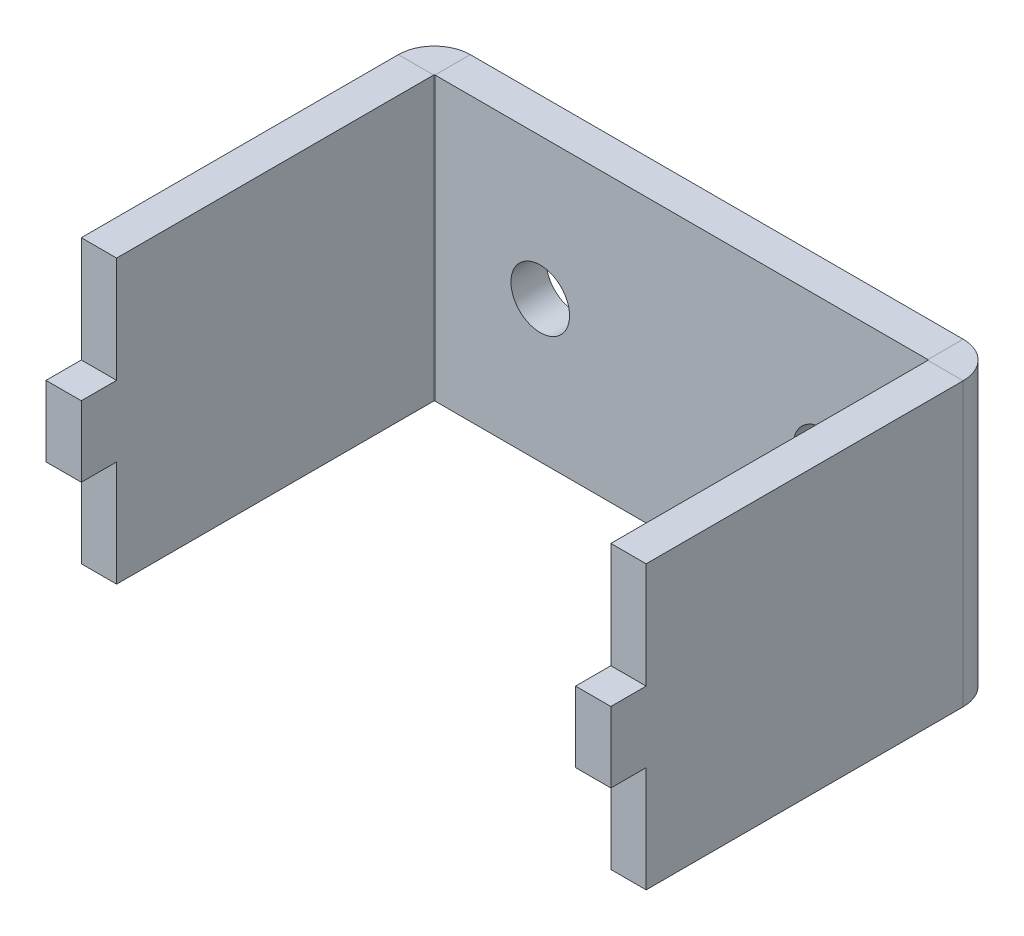
ISO-10303-21;
HEADER;
FILE_DESCRIPTION(('STEP AP214'),'2;1');
FILE_NAME('part.step','',(''),(''),'','','');
FILE_SCHEMA(('AUTOMOTIVE_DESIGN { 1 0 10303 214 1 1 1 1 }'));
ENDSEC;
DATA;
#1=APPLICATION_CONTEXT('core data for automotive mechanical design processes');
#2=APPLICATION_PROTOCOL_DEFINITION('international standard','automotive_design',2000,#1);
#3=PRODUCT_CONTEXT('',#1,'mechanical');
#4=PRODUCT('Part','Part','',(#3));
#5=PRODUCT_RELATED_PRODUCT_CATEGORY('part','',(#4));
#6=PRODUCT_DEFINITION_FORMATION('','',#4);
#7=PRODUCT_DEFINITION_CONTEXT('part definition',#1,'design');
#8=PRODUCT_DEFINITION('design','',#6,#7);
#9=PRODUCT_DEFINITION_SHAPE('','',#8);
#10=(LENGTH_UNIT() NAMED_UNIT(*) SI_UNIT(.MILLI.,.METRE.));
#11=(NAMED_UNIT(*) PLANE_ANGLE_UNIT() SI_UNIT($,.RADIAN.));
#12=(NAMED_UNIT(*) SI_UNIT($,.STERADIAN.) SOLID_ANGLE_UNIT());
#13=UNCERTAINTY_MEASURE_WITH_UNIT(LENGTH_MEASURE(1.E-05),#10,'distance_accuracy_value','');
#14=(GEOMETRIC_REPRESENTATION_CONTEXT(3) GLOBAL_UNCERTAINTY_ASSIGNED_CONTEXT((#13)) GLOBAL_UNIT_ASSIGNED_CONTEXT((#10,
#11,#12)) REPRESENTATION_CONTEXT('',''));
#15=CARTESIAN_POINT('',(0.,0.,0.));
#16=DIRECTION('',(0.,0.,1.));
#17=DIRECTION('',(1.,0.,0.));
#18=AXIS2_PLACEMENT_3D('',#15,#16,#17);
#19=CARTESIAN_POINT('',(-345.906372007027,89.,933.));
#20=DIRECTION('',(0.,1.,0.));
#21=DIRECTION('',(-1.,0.,0.));
#22=AXIS2_PLACEMENT_3D('',#19,#20,#21);
#23=PLANE('',#22);
#24=DIRECTION('',(0.,0.,1.));
#25=VECTOR('',#24,1.);
#26=CARTESIAN_POINT('',(-218.,89.,933.));
#27=LINE('',#26,#25);
#28=CARTESIAN_POINT('',(-218.,89.,933.));
#29=VERTEX_POINT('',#28);
#30=CARTESIAN_POINT('',(-218.,89.,938.));
#31=VERTEX_POINT('',#30);
#32=EDGE_CURVE('E245',#29,#31,#27,.T.);
#33=ORIENTED_EDGE('',*,*,#32,.T.);
#34=DIRECTION('',(1.,0.,0.));
#35=VECTOR('',#34,1.);
#36=CARTESIAN_POINT('',(-345.906372007027,89.,938.));
#37=LINE('',#36,#35);
#38=CARTESIAN_POINT('',(-223.,89.,938.));
#39=VERTEX_POINT('',#38);
#40=EDGE_CURVE('E636',#39,#31,#37,.T.);
#41=ORIENTED_EDGE('',*,*,#40,.F.);
#42=DIRECTION('',(0.,0.,1.));
#43=VECTOR('',#42,1.);
#44=CARTESIAN_POINT('',(-223.,89.,933.));
#45=LINE('',#44,#43);
#46=CARTESIAN_POINT('',(-223.,89.,933.));
#47=VERTEX_POINT('',#46);
#48=EDGE_CURVE('E443',#47,#39,#45,.T.);
#49=ORIENTED_EDGE('',*,*,#48,.F.);
#50=DIRECTION('',(1.,0.,0.));
#51=VECTOR('',#50,1.);
#52=CARTESIAN_POINT('',(-345.906372007027,89.,933.));
#53=LINE('',#52,#51);
#54=EDGE_CURVE('E631',#47,#29,#53,.T.);
#55=ORIENTED_EDGE('',*,*,#54,.T.);
#56=EDGE_LOOP('',(#33,#41,#49,#55));
#57=FACE_BOUND('',#56,.T.);
#58=ADVANCED_FACE('F47',(#57),#23,.F.);
#59=CARTESIAN_POINT('',(-345.906372007027,99.,938.));
#60=DIRECTION('',(0.,0.,-1.));
#61=DIRECTION('',(-1.,0.,0.));
#62=AXIS2_PLACEMENT_3D('',#59,#60,#61);
#63=PLANE('',#62);
#64=DIRECTION('',(0.,1.,0.));
#65=VECTOR('',#64,1.);
#66=CARTESIAN_POINT('',(-218.,99.,938.));
#67=LINE('',#66,#65);
#68=CARTESIAN_POINT('',(-218.,99.,938.));
#69=VERTEX_POINT('',#68);
#70=EDGE_CURVE('E638',#31,#69,#67,.T.);
#71=ORIENTED_EDGE('',*,*,#70,.T.);
#72=DIRECTION('',(1.,0.,0.));
#73=VECTOR('',#72,1.);
#74=CARTESIAN_POINT('',(-345.906372007027,99.,938.));
#75=LINE('',#74,#73);
#76=CARTESIAN_POINT('',(-223.,99.,938.));
#77=VERTEX_POINT('',#76);
#78=EDGE_CURVE('E618',#77,#69,#75,.T.);
#79=ORIENTED_EDGE('',*,*,#78,.F.);
#80=DIRECTION('',(0.,1.,0.));
#81=VECTOR('',#80,1.);
#82=CARTESIAN_POINT('',(-223.,99.,938.));
#83=LINE('',#82,#81);
#84=EDGE_CURVE('E454',#39,#77,#83,.T.);
#85=ORIENTED_EDGE('',*,*,#84,.F.);
#86=ORIENTED_EDGE('',*,*,#40,.T.);
#87=EDGE_LOOP('',(#71,#79,#85,#86));
#88=FACE_BOUND('',#87,.T.);
#89=ADVANCED_FACE('F581',(#88),#63,.F.);
#90=CARTESIAN_POINT('',(-345.906372007027,99.,933.));
#91=DIRECTION('',(0.,-1.,0.));
#92=DIRECTION('',(1.,0.,0.));
#93=AXIS2_PLACEMENT_3D('',#90,#91,#92);
#94=PLANE('',#93);
#95=DIRECTION('',(0.,0.,-1.));
#96=VECTOR('',#95,1.);
#97=CARTESIAN_POINT('',(-218.,99.,933.));
#98=LINE('',#97,#96);
#99=CARTESIAN_POINT('',(-218.,99.,933.));
#100=VERTEX_POINT('',#99);
#101=EDGE_CURVE('E613',#69,#100,#98,.T.);
#102=ORIENTED_EDGE('',*,*,#101,.T.);
#103=DIRECTION('',(1.,0.,0.));
#104=VECTOR('',#103,1.);
#105=CARTESIAN_POINT('',(-345.906372007027,99.,933.));
#106=LINE('',#105,#104);
#107=CARTESIAN_POINT('',(-223.,99.,933.));
#108=VERTEX_POINT('',#107);
#109=EDGE_CURVE('E617',#108,#100,#106,.T.);
#110=ORIENTED_EDGE('',*,*,#109,.F.);
#111=DIRECTION('',(0.,0.,-1.));
#112=VECTOR('',#111,1.);
#113=CARTESIAN_POINT('',(-223.,99.,933.));
#114=LINE('',#113,#112);
#115=EDGE_CURVE('E58',#77,#108,#114,.T.);
#116=ORIENTED_EDGE('',*,*,#115,.F.);
#117=ORIENTED_EDGE('',*,*,#78,.T.);
#118=EDGE_LOOP('',(#102,#110,#116,#117));
#119=FACE_BOUND('',#118,.T.);
#120=ADVANCED_FACE('F587',(#119),#94,.F.);
#121=CARTESIAN_POINT('',(-345.906372007027,74.,933.));
#122=DIRECTION('',(0.,0.,-1.));
#123=DIRECTION('',(-1.,0.,0.));
#124=AXIS2_PLACEMENT_3D('',#121,#122,#123);
#125=PLANE('',#124);
#126=DIRECTION('',(0.,1.,0.));
#127=VECTOR('',#126,1.);
#128=CARTESIAN_POINT('',(-218.,74.,933.));
#129=LINE('',#128,#127);
#130=CARTESIAN_POINT('',(-218.,114.,933.));
#131=VERTEX_POINT('',#130);
#132=EDGE_CURVE('E611',#100,#131,#129,.T.);
#133=ORIENTED_EDGE('',*,*,#132,.T.);
#134=DIRECTION('',(1.,0.,0.));
#135=VECTOR('',#134,1.);
#136=CARTESIAN_POINT('',(-345.906372007027,114.,933.));
#137=LINE('',#136,#135);
#138=CARTESIAN_POINT('',(-223.,114.,933.));
#139=VERTEX_POINT('',#138);
#140=EDGE_CURVE('E305',#139,#131,#137,.T.);
#141=ORIENTED_EDGE('',*,*,#140,.F.);
#142=DIRECTION('',(0.,1.,0.));
#143=VECTOR('',#142,1.);
#144=CARTESIAN_POINT('',(-223.,74.,933.));
#145=LINE('',#144,#143);
#146=EDGE_CURVE('E12',#108,#139,#145,.T.);
#147=ORIENTED_EDGE('',*,*,#146,.F.);
#148=ORIENTED_EDGE('',*,*,#109,.T.);
#149=EDGE_LOOP('',(#133,#141,#147,#148));
#150=FACE_BOUND('',#149,.T.);
#151=ADVANCED_FACE('F593',(#150),#125,.F.);
#152=CARTESIAN_POINT('',(-218.,74.,933.));
#153=VERTEX_POINT('',#152);
#154=EDGE_CURVE('E219',#153,#29,#129,.T.);
#155=ORIENTED_EDGE('',*,*,#154,.T.);
#156=ORIENTED_EDGE('',*,*,#54,.F.);
#157=CARTESIAN_POINT('',(-223.,74.,933.));
#158=VERTEX_POINT('',#157);
#159=EDGE_CURVE('E60',#158,#47,#145,.T.);
#160=ORIENTED_EDGE('',*,*,#159,.F.);
#161=DIRECTION('',(1.,0.,0.));
#162=VECTOR('',#161,1.);
#163=CARTESIAN_POINT('',(-345.906372007027,74.,933.));
#164=LINE('',#163,#162);
#165=EDGE_CURVE('E234',#158,#153,#164,.T.);
#166=ORIENTED_EDGE('',*,*,#165,.T.);
#167=EDGE_LOOP('',(#155,#156,#160,#166));
#168=FACE_BOUND('',#167,.T.);
#169=ADVANCED_FACE('F595',(#168),#125,.F.);
#170=CARTESIAN_POINT('',(-345.906372007027,74.,933.));
#171=DIRECTION('',(0.,-1.,0.));
#172=DIRECTION('',(1.,0.,0.));
#173=AXIS2_PLACEMENT_3D('',#170,#171,#172);
#174=PLANE('',#173);
#175=DIRECTION('',(1.,0.,0.));
#176=VECTOR('',#175,1.);
#177=CARTESIAN_POINT('',(-345.906372007027,74.,888.1));
#178=LINE('',#177,#176);
#179=CARTESIAN_POINT('',(-223.,74.,888.1));
#180=VERTEX_POINT('',#179);
#181=CARTESIAN_POINT('',(-218.,74.,888.1));
#182=VERTEX_POINT('',#181);
#183=EDGE_CURVE('E228',#180,#182,#178,.T.);
#184=ORIENTED_EDGE('',*,*,#183,.T.);
#185=DIRECTION('',(0.,0.,-1.));
#186=VECTOR('',#185,1.);
#187=CARTESIAN_POINT('',(-218.,74.,883.));
#188=LINE('',#187,#186);
#189=EDGE_CURVE('E211',#153,#182,#188,.T.);
#190=ORIENTED_EDGE('',*,*,#189,.F.);
#191=ORIENTED_EDGE('',*,*,#165,.F.);
#192=DIRECTION('',(0.,0.,-1.));
#193=VECTOR('',#192,1.);
#194=CARTESIAN_POINT('',(-223.,74.,933.));
#195=LINE('',#194,#193);
#196=EDGE_CURVE('E225',#158,#180,#195,.T.);
#197=ORIENTED_EDGE('',*,*,#196,.T.);
#198=EDGE_LOOP('',(#184,#190,#191,#197));
#199=FACE_BOUND('',#198,.T.);
#200=ADVANCED_FACE('F229',(#199),#174,.T.);
#201=CARTESIAN_POINT('',(-218.,74.,883.));
#202=DIRECTION('',(1.,0.,0.));
#203=DIRECTION('',(0.,0.,-1.));
#204=AXIS2_PLACEMENT_3D('',#201,#202,#203);
#205=PLANE('',#204);
#206=DIRECTION('',(0.,-1.,0.));
#207=VECTOR('',#206,1.);
#208=CARTESIAN_POINT('',(-218.,74.,888.1));
#209=LINE('',#208,#207);
#210=CARTESIAN_POINT('',(-218.,114.,888.1));
#211=VERTEX_POINT('',#210);
#212=EDGE_CURVE('E216',#211,#182,#209,.T.);
#213=ORIENTED_EDGE('',*,*,#212,.F.);
#214=DIRECTION('',(0.,0.,-1.));
#215=VECTOR('',#214,1.);
#216=CARTESIAN_POINT('',(-218.,114.,883.));
#217=LINE('',#216,#215);
#218=EDGE_CURVE('E224',#131,#211,#217,.T.);
#219=ORIENTED_EDGE('',*,*,#218,.F.);
#220=ORIENTED_EDGE('',*,*,#132,.F.);
#221=ORIENTED_EDGE('',*,*,#101,.F.);
#222=ORIENTED_EDGE('',*,*,#70,.F.);
#223=ORIENTED_EDGE('',*,*,#32,.F.);
#224=ORIENTED_EDGE('',*,*,#154,.F.);
#225=ORIENTED_EDGE('',*,*,#189,.T.);
#226=EDGE_LOOP('',(#213,#219,#220,#221,#222,#223,#224,#225));
#227=FACE_BOUND('',#226,.T.);
#228=ADVANCED_FACE('F213',(#227),#205,.T.);
#229=CARTESIAN_POINT('',(-345.906372007027,114.,933.));
#230=DIRECTION('',(0.,-1.,0.));
#231=DIRECTION('',(1.,0.,0.));
#232=AXIS2_PLACEMENT_3D('',#229,#230,#231);
#233=PLANE('',#232);
#234=ORIENTED_EDGE('',*,*,#218,.T.);
#235=DIRECTION('',(1.,0.,0.));
#236=VECTOR('',#235,1.);
#237=CARTESIAN_POINT('',(-345.906372007027,114.,888.1));
#238=LINE('',#237,#236);
#239=CARTESIAN_POINT('',(-223.,114.,888.1));
#240=VERTEX_POINT('',#239);
#241=EDGE_CURVE('E51',#240,#211,#238,.T.);
#242=ORIENTED_EDGE('',*,*,#241,.F.);
#243=DIRECTION('',(0.,0.,-1.));
#244=VECTOR('',#243,1.);
#245=CARTESIAN_POINT('',(-223.,114.,933.));
#246=LINE('',#245,#244);
#247=EDGE_CURVE('E107',#139,#240,#246,.T.);
#248=ORIENTED_EDGE('',*,*,#247,.F.);
#249=ORIENTED_EDGE('',*,*,#140,.T.);
#250=EDGE_LOOP('',(#234,#242,#248,#249));
#251=FACE_BOUND('',#250,.T.);
#252=ADVANCED_FACE('F602',(#251),#233,.F.);
#253=CARTESIAN_POINT('',(-223.,74.,933.));
#254=DIRECTION('',(1.,0.,0.));
#255=DIRECTION('',(0.,0.,-1.));
#256=AXIS2_PLACEMENT_3D('',#253,#254,#255);
#257=PLANE('',#256);
#258=ORIENTED_EDGE('',*,*,#247,.T.);
#259=DIRECTION('',(0.,-1.,0.));
#260=VECTOR('',#259,1.);
#261=CARTESIAN_POINT('',(-223.,74.,888.1));
#262=LINE('',#261,#260);
#263=EDGE_CURVE('E111',#240,#180,#262,.T.);
#264=ORIENTED_EDGE('',*,*,#263,.T.);
#265=ORIENTED_EDGE('',*,*,#196,.F.);
#266=ORIENTED_EDGE('',*,*,#159,.T.);
#267=ORIENTED_EDGE('',*,*,#48,.T.);
#268=ORIENTED_EDGE('',*,*,#84,.T.);
#269=ORIENTED_EDGE('',*,*,#115,.T.);
#270=ORIENTED_EDGE('',*,*,#146,.T.);
#271=EDGE_LOOP('',(#258,#264,#265,#266,#267,#268,#269,#270));
#272=FACE_BOUND('',#271,.T.);
#273=ADVANCED_FACE('F49',(#272),#257,.F.);
#274=CARTESIAN_POINT('',(-170.093627992973,99.,933.));
#275=DIRECTION('',(0.,1.,0.));
#276=DIRECTION('',(1.,0.,0.));
#277=AXIS2_PLACEMENT_3D('',#274,#275,#276);
#278=PLANE('',#277);
#279=DIRECTION('',(-1.,0.,0.));
#280=VECTOR('',#279,1.);
#281=CARTESIAN_POINT('',(-170.093627992973,99.,933.));
#282=LINE('',#281,#280);
#283=CARTESIAN_POINT('',(-293.,99.,933.));
#284=VERTEX_POINT('',#283);
#285=CARTESIAN_POINT('',(-298.,99.,933.));
#286=VERTEX_POINT('',#285);
#287=EDGE_CURVE('E491',#284,#286,#282,.T.);
#288=ORIENTED_EDGE('',*,*,#287,.T.);
#289=DIRECTION('',(0.,0.,-1.));
#290=VECTOR('',#289,1.);
#291=CARTESIAN_POINT('',(-298.,99.,933.));
#292=LINE('',#291,#290);
#293=CARTESIAN_POINT('',(-298.,99.,938.));
#294=VERTEX_POINT('',#293);
#295=EDGE_CURVE('E333',#294,#286,#292,.T.);
#296=ORIENTED_EDGE('',*,*,#295,.F.);
#297=DIRECTION('',(-1.,0.,0.));
#298=VECTOR('',#297,1.);
#299=CARTESIAN_POINT('',(-170.093627992973,99.,938.));
#300=LINE('',#299,#298);
#301=CARTESIAN_POINT('',(-293.,99.,938.));
#302=VERTEX_POINT('',#301);
#303=EDGE_CURVE('E499',#302,#294,#300,.T.);
#304=ORIENTED_EDGE('',*,*,#303,.F.);
#305=DIRECTION('',(0.,0.,-1.));
#306=VECTOR('',#305,1.);
#307=CARTESIAN_POINT('',(-293.,99.,933.));
#308=LINE('',#307,#306);
#309=EDGE_CURVE('E495',#302,#284,#308,.T.);
#310=ORIENTED_EDGE('',*,*,#309,.T.);
#311=EDGE_LOOP('',(#288,#296,#304,#310));
#312=FACE_BOUND('',#311,.T.);
#313=ADVANCED_FACE('F557',(#312),#278,.T.);
#314=CARTESIAN_POINT('',(-170.093627992973,99.,938.));
#315=DIRECTION('',(0.,0.,1.));
#316=DIRECTION('',(1.,0.,0.));
#317=AXIS2_PLACEMENT_3D('',#314,#315,#316);
#318=PLANE('',#317);
#319=ORIENTED_EDGE('',*,*,#303,.T.);
#320=DIRECTION('',(0.,1.,0.));
#321=VECTOR('',#320,1.);
#322=CARTESIAN_POINT('',(-298.,99.,938.));
#323=LINE('',#322,#321);
#324=CARTESIAN_POINT('',(-298.,89.,938.));
#325=VERTEX_POINT('',#324);
#326=EDGE_CURVE('E552',#325,#294,#323,.T.);
#327=ORIENTED_EDGE('',*,*,#326,.F.);
#328=DIRECTION('',(-1.,0.,0.));
#329=VECTOR('',#328,1.);
#330=CARTESIAN_POINT('',(-170.093627992973,89.,938.));
#331=LINE('',#330,#329);
#332=CARTESIAN_POINT('',(-293.,89.,938.));
#333=VERTEX_POINT('',#332);
#334=EDGE_CURVE('E505',#333,#325,#331,.T.);
#335=ORIENTED_EDGE('',*,*,#334,.F.);
#336=DIRECTION('',(0.,1.,0.));
#337=VECTOR('',#336,1.);
#338=CARTESIAN_POINT('',(-293.,99.,938.));
#339=LINE('',#338,#337);
#340=EDGE_CURVE('E501',#333,#302,#339,.T.);
#341=ORIENTED_EDGE('',*,*,#340,.T.);
#342=EDGE_LOOP('',(#319,#327,#335,#341));
#343=FACE_BOUND('',#342,.T.);
#344=ADVANCED_FACE('F550',(#343),#318,.T.);
#345=CARTESIAN_POINT('',(-170.093627992973,89.,933.));
#346=DIRECTION('',(0.,-1.,0.));
#347=DIRECTION('',(-1.,0.,0.));
#348=AXIS2_PLACEMENT_3D('',#345,#346,#347);
#349=PLANE('',#348);
#350=ORIENTED_EDGE('',*,*,#334,.T.);
#351=DIRECTION('',(0.,0.,1.));
#352=VECTOR('',#351,1.);
#353=CARTESIAN_POINT('',(-298.,89.,933.));
#354=LINE('',#353,#352);
#355=CARTESIAN_POINT('',(-298.,89.,933.));
#356=VERTEX_POINT('',#355);
#357=EDGE_CURVE('E331',#356,#325,#354,.T.);
#358=ORIENTED_EDGE('',*,*,#357,.F.);
#359=DIRECTION('',(-1.,0.,0.));
#360=VECTOR('',#359,1.);
#361=CARTESIAN_POINT('',(-170.093627992973,89.,933.));
#362=LINE('',#361,#360);
#363=CARTESIAN_POINT('',(-293.,89.,933.));
#364=VERTEX_POINT('',#363);
#365=EDGE_CURVE('E511',#364,#356,#362,.T.);
#366=ORIENTED_EDGE('',*,*,#365,.F.);
#367=DIRECTION('',(0.,0.,1.));
#368=VECTOR('',#367,1.);
#369=CARTESIAN_POINT('',(-293.,89.,933.));
#370=LINE('',#369,#368);
#371=EDGE_CURVE('E508',#364,#333,#370,.T.);
#372=ORIENTED_EDGE('',*,*,#371,.T.);
#373=EDGE_LOOP('',(#350,#358,#366,#372));
#374=FACE_BOUND('',#373,.T.);
#375=ADVANCED_FACE('F560',(#374),#349,.T.);
#376=CARTESIAN_POINT('',(-170.093627992973,74.,933.));
#377=DIRECTION('',(0.,0.,1.));
#378=DIRECTION('',(1.,0.,0.));
#379=AXIS2_PLACEMENT_3D('',#376,#377,#378);
#380=PLANE('',#379);
#381=ORIENTED_EDGE('',*,*,#365,.T.);
#382=DIRECTION('',(0.,1.,0.));
#383=VECTOR('',#382,1.);
#384=CARTESIAN_POINT('',(-298.,74.,933.));
#385=LINE('',#384,#383);
#386=CARTESIAN_POINT('',(-298.,74.,933.));
#387=VERTEX_POINT('',#386);
#388=EDGE_CURVE('E327',#387,#356,#385,.T.);
#389=ORIENTED_EDGE('',*,*,#388,.F.);
#390=DIRECTION('',(-1.,0.,0.));
#391=VECTOR('',#390,1.);
#392=CARTESIAN_POINT('',(-170.093627992973,74.,933.));
#393=LINE('',#392,#391);
#394=CARTESIAN_POINT('',(-293.,74.,933.));
#395=VERTEX_POINT('',#394);
#396=EDGE_CURVE('E323',#395,#387,#393,.T.);
#397=ORIENTED_EDGE('',*,*,#396,.F.);
#398=DIRECTION('',(0.,1.,0.));
#399=VECTOR('',#398,1.);
#400=CARTESIAN_POINT('',(-293.,74.,933.));
#401=LINE('',#400,#399);
#402=EDGE_CURVE('E356',#395,#364,#401,.T.);
#403=ORIENTED_EDGE('',*,*,#402,.T.);
#404=EDGE_LOOP('',(#381,#389,#397,#403));
#405=FACE_BOUND('',#404,.T.);
#406=ADVANCED_FACE('F570',(#405),#380,.T.);
#407=DIRECTION('',(-1.,0.,0.));
#408=VECTOR('',#407,1.);
#409=CARTESIAN_POINT('',(-170.093627992973,114.,933.));
#410=LINE('',#409,#408);
#411=CARTESIAN_POINT('',(-293.,114.,933.));
#412=VERTEX_POINT('',#411);
#413=CARTESIAN_POINT('',(-298.,114.,933.));
#414=VERTEX_POINT('',#413);
#415=EDGE_CURVE('E355',#412,#414,#410,.T.);
#416=ORIENTED_EDGE('',*,*,#415,.T.);
#417=EDGE_CURVE('E326',#286,#414,#385,.T.);
#418=ORIENTED_EDGE('',*,*,#417,.F.);
#419=ORIENTED_EDGE('',*,*,#287,.F.);
#420=EDGE_CURVE('E350',#284,#412,#401,.T.);
#421=ORIENTED_EDGE('',*,*,#420,.T.);
#422=EDGE_LOOP('',(#416,#418,#419,#421));
#423=FACE_BOUND('',#422,.T.);
#424=ADVANCED_FACE('F523',(#423),#380,.T.);
#425=CARTESIAN_POINT('',(-170.093627992973,114.,933.));
#426=DIRECTION('',(0.,-1.,0.));
#427=DIRECTION('',(-1.,0.,0.));
#428=AXIS2_PLACEMENT_3D('',#425,#426,#427);
#429=PLANE('',#428);
#430=DIRECTION('',(0.,0.,1.));
#431=VECTOR('',#430,1.);
#432=CARTESIAN_POINT('',(-298.,114.,933.));
#433=LINE('',#432,#431);
#434=CARTESIAN_POINT('',(-298.,114.,888.1));
#435=VERTEX_POINT('',#434);
#436=EDGE_CURVE('E344',#435,#414,#433,.T.);
#437=ORIENTED_EDGE('',*,*,#436,.T.);
#438=ORIENTED_EDGE('',*,*,#415,.F.);
#439=DIRECTION('',(0.,0.,1.));
#440=VECTOR('',#439,1.);
#441=CARTESIAN_POINT('',(-293.,114.,933.));
#442=LINE('',#441,#440);
#443=CARTESIAN_POINT('',(-293.,114.,888.1));
#444=VERTEX_POINT('',#443);
#445=EDGE_CURVE('E169',#444,#412,#442,.T.);
#446=ORIENTED_EDGE('',*,*,#445,.F.);
#447=DIRECTION('',(-1.,0.,0.));
#448=VECTOR('',#447,1.);
#449=CARTESIAN_POINT('',(-170.093627992973,114.,888.1));
#450=LINE('',#449,#448);
#451=EDGE_CURVE('E332',#444,#435,#450,.T.);
#452=ORIENTED_EDGE('',*,*,#451,.T.);
#453=EDGE_LOOP('',(#437,#438,#446,#452));
#454=FACE_BOUND('',#453,.T.);
#455=ADVANCED_FACE('F525',(#454),#429,.F.);
#456=CARTESIAN_POINT('',(-298.,74.,933.));
#457=DIRECTION('',(-1.,0.,0.));
#458=DIRECTION('',(0.,0.,1.));
#459=AXIS2_PLACEMENT_3D('',#456,#457,#458);
#460=PLANE('',#459);
#461=DIRECTION('',(0.,1.,0.));
#462=VECTOR('',#461,1.);
#463=CARTESIAN_POINT('',(-298.,114.,888.1));
#464=LINE('',#463,#462);
#465=CARTESIAN_POINT('',(-298.,74.,888.1));
#466=VERTEX_POINT('',#465);
#467=EDGE_CURVE('E487',#466,#435,#464,.T.);
#468=ORIENTED_EDGE('',*,*,#467,.F.);
#469=DIRECTION('',(0.,0.,-1.));
#470=VECTOR('',#469,1.);
#471=CARTESIAN_POINT('',(-298.,74.,933.));
#472=LINE('',#471,#470);
#473=EDGE_CURVE('E318',#387,#466,#472,.T.);
#474=ORIENTED_EDGE('',*,*,#473,.F.);
#475=ORIENTED_EDGE('',*,*,#388,.T.);
#476=ORIENTED_EDGE('',*,*,#357,.T.);
#477=ORIENTED_EDGE('',*,*,#326,.T.);
#478=ORIENTED_EDGE('',*,*,#295,.T.);
#479=ORIENTED_EDGE('',*,*,#417,.T.);
#480=ORIENTED_EDGE('',*,*,#436,.F.);
#481=EDGE_LOOP('',(#468,#474,#475,#476,#477,#478,#479,#480));
#482=FACE_BOUND('',#481,.T.);
#483=ADVANCED_FACE('F529',(#482),#460,.T.);
#484=CARTESIAN_POINT('',(-170.093627992973,74.,933.));
#485=DIRECTION('',(0.,-1.,0.));
#486=DIRECTION('',(-1.,0.,0.));
#487=AXIS2_PLACEMENT_3D('',#484,#485,#486);
#488=PLANE('',#487);
#489=ORIENTED_EDGE('',*,*,#396,.T.);
#490=ORIENTED_EDGE('',*,*,#473,.T.);
#491=DIRECTION('',(-1.,0.,0.));
#492=VECTOR('',#491,1.);
#493=CARTESIAN_POINT('',(-170.093627992973,74.,888.1));
#494=LINE('',#493,#492);
#495=CARTESIAN_POINT('',(-293.,74.,888.1));
#496=VERTEX_POINT('',#495);
#497=EDGE_CURVE('E163',#496,#466,#494,.T.);
#498=ORIENTED_EDGE('',*,*,#497,.F.);
#499=DIRECTION('',(0.,0.,-1.));
#500=VECTOR('',#499,1.);
#501=CARTESIAN_POINT('',(-293.,74.,933.));
#502=LINE('',#501,#500);
#503=EDGE_CURVE('E120',#395,#496,#502,.T.);
#504=ORIENTED_EDGE('',*,*,#503,.F.);
#505=EDGE_LOOP('',(#489,#490,#498,#504));
#506=FACE_BOUND('',#505,.T.);
#507=ADVANCED_FACE('F571',(#506),#488,.T.);
#508=CARTESIAN_POINT('',(-293.,74.,933.));
#509=DIRECTION('',(-1.,0.,0.));
#510=DIRECTION('',(0.,0.,1.));
#511=AXIS2_PLACEMENT_3D('',#508,#509,#510);
#512=PLANE('',#511);
#513=ORIENTED_EDGE('',*,*,#503,.T.);
#514=DIRECTION('',(0.,1.,0.));
#515=VECTOR('',#514,1.);
#516=CARTESIAN_POINT('',(-293.,114.,888.1));
#517=LINE('',#516,#515);
#518=EDGE_CURVE('E429',#496,#444,#517,.T.);
#519=ORIENTED_EDGE('',*,*,#518,.T.);
#520=ORIENTED_EDGE('',*,*,#445,.T.);
#521=ORIENTED_EDGE('',*,*,#420,.F.);
#522=ORIENTED_EDGE('',*,*,#309,.F.);
#523=ORIENTED_EDGE('',*,*,#340,.F.);
#524=ORIENTED_EDGE('',*,*,#371,.F.);
#525=ORIENTED_EDGE('',*,*,#402,.F.);
#526=EDGE_LOOP('',(#513,#519,#520,#521,#522,#523,#524,#525));
#527=FACE_BOUND('',#526,.T.);
#528=ADVANCED_FACE('F410',(#527),#512,.F.);
#529=CARTESIAN_POINT('',(-298.,74.,883.));
#530=DIRECTION('',(0.,0.,-1.));
#531=DIRECTION('',(-1.,0.,0.));
#532=AXIS2_PLACEMENT_3D('',#529,#530,#531);
#533=PLANE('',#532);
#534=CARTESIAN_POINT('',(-238.,94.,883.));
#535=DIRECTION('',(0.,0.,-1.));
#536=DIRECTION('',(-1.,0.,0.));
#537=AXIS2_PLACEMENT_3D('',#534,#535,#536);
#538=CIRCLE('',#537,4.15);
#539=CARTESIAN_POINT('',(-242.15,94.,883.));
#540=VERTEX_POINT('',#539);
#541=EDGE_CURVE('E371',#540,#540,#538,.T.);
#542=ORIENTED_EDGE('',*,*,#541,.F.);
#543=EDGE_LOOP('',(#542));
#544=FACE_BOUND('',#543,.T.);
#545=CARTESIAN_POINT('',(-278.,94.,883.));
#546=DIRECTION('',(0.,0.,-1.));
#547=DIRECTION('',(-1.,0.,0.));
#548=AXIS2_PLACEMENT_3D('',#545,#546,#547);
#549=CIRCLE('',#548,4.15);
#550=CARTESIAN_POINT('',(-282.15,94.,883.));
#551=VERTEX_POINT('',#550);
#552=EDGE_CURVE('E377',#551,#551,#549,.T.);
#553=ORIENTED_EDGE('',*,*,#552,.F.);
#554=EDGE_LOOP('',(#553));
#555=FACE_BOUND('',#554,.T.);
#556=DIRECTION('',(-1.,0.,0.));
#557=VECTOR('',#556,1.);
#558=CARTESIAN_POINT('',(-298.,114.,883.));
#559=LINE('',#558,#557);
#560=CARTESIAN_POINT('',(-223.1,114.,883.));
#561=VERTEX_POINT('',#560);
#562=CARTESIAN_POINT('',(-292.9,114.,883.));
#563=VERTEX_POINT('',#562);
#564=EDGE_CURVE('E376',#561,#563,#559,.T.);
#565=ORIENTED_EDGE('',*,*,#564,.F.);
#566=DIRECTION('',(0.,-1.,0.));
#567=VECTOR('',#566,1.);
#568=CARTESIAN_POINT('',(-223.1,74.,883.));
#569=LINE('',#568,#567);
#570=CARTESIAN_POINT('',(-223.1,74.,883.));
#571=VERTEX_POINT('',#570);
#572=EDGE_CURVE('E264',#561,#571,#569,.T.);
#573=ORIENTED_EDGE('',*,*,#572,.T.);
#574=DIRECTION('',(-1.,0.,0.));
#575=VECTOR('',#574,1.);
#576=CARTESIAN_POINT('',(-298.,74.,883.));
#577=LINE('',#576,#575);
#578=CARTESIAN_POINT('',(-292.9,74.,883.));
#579=VERTEX_POINT('',#578);
#580=EDGE_CURVE('E383',#571,#579,#577,.T.);
#581=ORIENTED_EDGE('',*,*,#580,.T.);
#582=DIRECTION('',(0.,1.,0.));
#583=VECTOR('',#582,1.);
#584=CARTESIAN_POINT('',(-292.9,114.,883.));
#585=LINE('',#584,#583);
#586=EDGE_CURVE('E290',#579,#563,#585,.T.);
#587=ORIENTED_EDGE('',*,*,#586,.T.);
#588=EDGE_LOOP('',(#565,#573,#581,#587));
#589=FACE_BOUND('',#588,.T.);
#590=ADVANCED_FACE('F406',(#544,#555,#589),#533,.T.);
#591=CARTESIAN_POINT('',(257.,114.,888.));
#592=DIRECTION('',(0.,0.,1.));
#593=DIRECTION('',(1.,0.,0.));
#594=AXIS2_PLACEMENT_3D('',#591,#592,#593);
#595=PLANE('',#594);
#596=CARTESIAN_POINT('',(-278.,94.,888.));
#597=DIRECTION('',(0.,0.,1.));
#598=DIRECTION('',(1.,0.,0.));
#599=AXIS2_PLACEMENT_3D('',#596,#597,#598);
#600=CIRCLE('',#599,4.15);
#601=CARTESIAN_POINT('',(-273.85,94.,888.));
#602=VERTEX_POINT('',#601);
#603=EDGE_CURVE('E472',#602,#602,#600,.F.);
#604=ORIENTED_EDGE('',*,*,#603,.T.);
#605=EDGE_LOOP('',(#604));
#606=FACE_BOUND('',#605,.T.);
#607=CARTESIAN_POINT('',(-238.,94.,888.));
#608=DIRECTION('',(0.,0.,1.));
#609=DIRECTION('',(1.,0.,0.));
#610=AXIS2_PLACEMENT_3D('',#607,#608,#609);
#611=CIRCLE('',#610,4.15);
#612=CARTESIAN_POINT('',(-233.85,94.,888.));
#613=VERTEX_POINT('',#612);
#614=EDGE_CURVE('E391',#613,#613,#611,.F.);
#615=ORIENTED_EDGE('',*,*,#614,.T.);
#616=EDGE_LOOP('',(#615));
#617=FACE_BOUND('',#616,.T.);
#618=DIRECTION('',(-1.,0.,0.));
#619=VECTOR('',#618,1.);
#620=CARTESIAN_POINT('',(-223.,74.,888.));
#621=LINE('',#620,#619);
#622=CARTESIAN_POINT('',(-223.1,74.,888.));
#623=VERTEX_POINT('',#622);
#624=CARTESIAN_POINT('',(-292.9,74.,888.));
#625=VERTEX_POINT('',#624);
#626=EDGE_CURVE('E387',#623,#625,#621,.T.);
#627=ORIENTED_EDGE('',*,*,#626,.F.);
#628=DIRECTION('',(0.,1.,0.));
#629=VECTOR('',#628,1.);
#630=CARTESIAN_POINT('',(-223.1,74.,888.));
#631=LINE('',#630,#629);
#632=CARTESIAN_POINT('',(-223.1,114.,888.));
#633=VERTEX_POINT('',#632);
#634=EDGE_CURVE('E270',#623,#633,#631,.T.);
#635=ORIENTED_EDGE('',*,*,#634,.T.);
#636=DIRECTION('',(-1.,0.,0.));
#637=VECTOR('',#636,1.);
#638=CARTESIAN_POINT('',(-223.,114.,888.));
#639=LINE('',#638,#637);
#640=CARTESIAN_POINT('',(-292.9,114.,888.));
#641=VERTEX_POINT('',#640);
#642=EDGE_CURVE('E392',#633,#641,#639,.T.);
#643=ORIENTED_EDGE('',*,*,#642,.T.);
#644=DIRECTION('',(0.,-1.,0.));
#645=VECTOR('',#644,1.);
#646=CARTESIAN_POINT('',(-292.9,114.,888.));
#647=LINE('',#646,#645);
#648=EDGE_CURVE('E285',#641,#625,#647,.T.);
#649=ORIENTED_EDGE('',*,*,#648,.T.);
#650=EDGE_LOOP('',(#627,#635,#643,#649));
#651=FACE_BOUND('',#650,.T.);
#652=ADVANCED_FACE('F409',(#606,#617,#651),#595,.T.);
#653=CARTESIAN_POINT('',(-238.,94.,883.));
#654=DIRECTION('',(0.,0.,-1.));
#655=DIRECTION('',(-1.,0.,0.));
#656=AXIS2_PLACEMENT_3D('',#653,#654,#655);
#657=CYLINDRICAL_SURFACE('',#656,4.15);
#658=ORIENTED_EDGE('',*,*,#541,.T.);
#659=EDGE_LOOP('',(#658));
#660=FACE_BOUND('',#659,.T.);
#661=ORIENTED_EDGE('',*,*,#614,.F.);
#662=EDGE_LOOP('',(#661));
#663=FACE_BOUND('',#662,.T.);
#664=ADVANCED_FACE('F731',(#660,#663),#657,.F.);
#665=CARTESIAN_POINT('',(-278.,94.,883.));
#666=DIRECTION('',(0.,0.,-1.));
#667=DIRECTION('',(-1.,0.,0.));
#668=AXIS2_PLACEMENT_3D('',#665,#666,#667);
#669=CYLINDRICAL_SURFACE('',#668,4.15);
#670=ORIENTED_EDGE('',*,*,#552,.T.);
#671=EDGE_LOOP('',(#670));
#672=FACE_BOUND('',#671,.T.);
#673=ORIENTED_EDGE('',*,*,#603,.F.);
#674=EDGE_LOOP('',(#673));
#675=FACE_BOUND('',#674,.T.);
#676=ADVANCED_FACE('F403',(#672,#675),#669,.F.);
#677=CARTESIAN_POINT('',(-223.,74.,1043.89798009919));
#678=DIRECTION('',(0.,-1.,0.));
#679=DIRECTION('',(0.,0.,-1.));
#680=AXIS2_PLACEMENT_3D('',#677,#678,#679);
#681=PLANE('',#680);
#682=DIRECTION('',(0.,0.,-1.));
#683=VECTOR('',#682,1.);
#684=CARTESIAN_POINT('',(-292.9,74.,1043.89798009919));
#685=LINE('',#684,#683);
#686=EDGE_CURVE('E269',#625,#579,#685,.T.);
#687=ORIENTED_EDGE('',*,*,#686,.T.);
#688=ORIENTED_EDGE('',*,*,#580,.F.);
#689=DIRECTION('',(0.,0.,-1.));
#690=VECTOR('',#689,1.);
#691=CARTESIAN_POINT('',(-223.1,74.,1043.89798009919));
#692=LINE('',#691,#690);
#693=EDGE_CURVE('E248',#623,#571,#692,.T.);
#694=ORIENTED_EDGE('',*,*,#693,.F.);
#695=ORIENTED_EDGE('',*,*,#626,.T.);
#696=EDGE_LOOP('',(#687,#688,#694,#695));
#697=FACE_BOUND('',#696,.T.);
#698=ADVANCED_FACE('F540',(#697),#681,.T.);
#699=CARTESIAN_POINT('',(-223.,114.,1043.89798009919));
#700=DIRECTION('',(0.,-1.,0.));
#701=DIRECTION('',(0.,0.,-1.));
#702=AXIS2_PLACEMENT_3D('',#699,#700,#701);
#703=PLANE('',#702);
#704=ORIENTED_EDGE('',*,*,#564,.T.);
#705=DIRECTION('',(0.,0.,-1.));
#706=VECTOR('',#705,1.);
#707=CARTESIAN_POINT('',(-292.9,114.,1043.89798009919));
#708=LINE('',#707,#706);
#709=EDGE_CURVE('E276',#641,#563,#708,.T.);
#710=ORIENTED_EDGE('',*,*,#709,.F.);
#711=ORIENTED_EDGE('',*,*,#642,.F.);
#712=DIRECTION('',(0.,0.,-1.));
#713=VECTOR('',#712,1.);
#714=CARTESIAN_POINT('',(-223.1,114.,1043.89798009919));
#715=LINE('',#714,#713);
#716=EDGE_CURVE('E279',#633,#561,#715,.T.);
#717=ORIENTED_EDGE('',*,*,#716,.T.);
#718=EDGE_LOOP('',(#704,#710,#711,#717));
#719=FACE_BOUND('',#718,.T.);
#720=ADVANCED_FACE('F420',(#719),#703,.F.);
#721=CARTESIAN_POINT('',(-292.9,74.,888.1));
#722=DIRECTION('',(0.,-1.,0.));
#723=DIRECTION('',(0.,0.,-1.));
#724=AXIS2_PLACEMENT_3D('',#721,#722,#723);
#725=PLANE('',#724);
#726=ORIENTED_EDGE('',*,*,#686,.F.);
#727=CARTESIAN_POINT('',(-292.9,74.,888.1));
#728=DIRECTION('',(0.,-1.,0.));
#729=DIRECTION('',(0.,0.,-1.));
#730=AXIS2_PLACEMENT_3D('',#727,#728,#729);
#731=CIRCLE('',#730,0.0999999999999961);
#732=EDGE_CURVE('E184',#625,#496,#731,.F.);
#733=ORIENTED_EDGE('',*,*,#732,.T.);
#734=ORIENTED_EDGE('',*,*,#497,.T.);
#735=CARTESIAN_POINT('',(-292.9,74.,888.1));
#736=DIRECTION('',(0.,-1.,0.));
#737=DIRECTION('',(0.,0.,-1.));
#738=AXIS2_PLACEMENT_3D('',#735,#736,#737);
#739=CIRCLE('',#738,5.1);
#740=EDGE_CURVE('E468',#579,#466,#739,.F.);
#741=ORIENTED_EDGE('',*,*,#740,.F.);
#742=EDGE_LOOP('',(#726,#733,#734,#741));
#743=FACE_BOUND('',#742,.T.);
#744=ADVANCED_FACE('F542',(#743),#725,.T.);
#745=CARTESIAN_POINT('',(-292.9,114.,888.1));
#746=DIRECTION('',(0.,1.,0.));
#747=DIRECTION('',(0.,0.,1.));
#748=AXIS2_PLACEMENT_3D('',#745,#746,#747);
#749=PLANE('',#748);
#750=ORIENTED_EDGE('',*,*,#451,.F.);
#751=CARTESIAN_POINT('',(-292.9,114.,888.1));
#752=DIRECTION('',(0.,-1.,0.));
#753=DIRECTION('',(0.,0.,-1.));
#754=AXIS2_PLACEMENT_3D('',#751,#752,#753);
#755=CIRCLE('',#754,0.0999999999999961);
#756=EDGE_CURVE('E253',#444,#641,#755,.T.);
#757=ORIENTED_EDGE('',*,*,#756,.T.);
#758=ORIENTED_EDGE('',*,*,#709,.T.);
#759=CARTESIAN_POINT('',(-292.9,114.,888.1));
#760=DIRECTION('',(0.,-1.,0.));
#761=DIRECTION('',(0.,0.,-1.));
#762=AXIS2_PLACEMENT_3D('',#759,#760,#761);
#763=CIRCLE('',#762,5.1);
#764=EDGE_CURVE('E471',#435,#563,#763,.T.);
#765=ORIENTED_EDGE('',*,*,#764,.F.);
#766=EDGE_LOOP('',(#750,#757,#758,#765));
#767=FACE_BOUND('',#766,.T.);
#768=ADVANCED_FACE('F532',(#767),#749,.T.);
#769=CARTESIAN_POINT('',(-292.9,292.608510435533,888.1));
#770=DIRECTION('',(0.,-1.,0.));
#771=DIRECTION('',(0.,0.,-1.));
#772=AXIS2_PLACEMENT_3D('',#769,#770,#771);
#773=CYLINDRICAL_SURFACE('',#772,5.1);
#774=ORIENTED_EDGE('',*,*,#764,.T.);
#775=ORIENTED_EDGE('',*,*,#586,.F.);
#776=ORIENTED_EDGE('',*,*,#740,.T.);
#777=ORIENTED_EDGE('',*,*,#467,.T.);
#778=EDGE_LOOP('',(#774,#775,#776,#777));
#779=FACE_BOUND('',#778,.T.);
#780=ADVANCED_FACE('F530',(#779),#773,.T.);
#781=CARTESIAN_POINT('',(-292.9,292.608510435533,888.1));
#782=DIRECTION('',(0.,-1.,0.));
#783=DIRECTION('',(0.,0.,-1.));
#784=AXIS2_PLACEMENT_3D('',#781,#782,#783);
#785=CYLINDRICAL_SURFACE('',#784,0.0999999999999961);
#786=ORIENTED_EDGE('',*,*,#756,.F.);
#787=ORIENTED_EDGE('',*,*,#518,.F.);
#788=ORIENTED_EDGE('',*,*,#732,.F.);
#789=ORIENTED_EDGE('',*,*,#648,.F.);
#790=EDGE_LOOP('',(#786,#787,#788,#789));
#791=FACE_BOUND('',#790,.T.);
#792=ADVANCED_FACE('F534',(#791),#785,.F.);
#793=CARTESIAN_POINT('',(-223.1,114.,888.1));
#794=DIRECTION('',(0.,1.,0.));
#795=DIRECTION('',(0.,0.,1.));
#796=AXIS2_PLACEMENT_3D('',#793,#794,#795);
#797=PLANE('',#796);
#798=ORIENTED_EDGE('',*,*,#716,.F.);
#799=CARTESIAN_POINT('',(-223.1,114.,888.1));
#800=DIRECTION('',(0.,1.,0.));
#801=DIRECTION('',(0.,0.,1.));
#802=AXIS2_PLACEMENT_3D('',#799,#800,#801);
#803=CIRCLE('',#802,0.100000000000023);
#804=EDGE_CURVE('E176',#633,#240,#803,.F.);
#805=ORIENTED_EDGE('',*,*,#804,.T.);
#806=ORIENTED_EDGE('',*,*,#241,.T.);
#807=CARTESIAN_POINT('',(-223.1,114.,888.1));
#808=DIRECTION('',(0.,1.,0.));
#809=DIRECTION('',(0.,0.,1.));
#810=AXIS2_PLACEMENT_3D('',#807,#808,#809);
#811=CIRCLE('',#810,5.10000000000003);
#812=EDGE_CURVE('E243',#561,#211,#811,.F.);
#813=ORIENTED_EDGE('',*,*,#812,.F.);
#814=EDGE_LOOP('',(#798,#805,#806,#813));
#815=FACE_BOUND('',#814,.T.);
#816=ADVANCED_FACE('F425',(#815),#797,.T.);
#817=CARTESIAN_POINT('',(-223.1,74.,888.1));
#818=DIRECTION('',(0.,-1.,0.));
#819=DIRECTION('',(0.,0.,-1.));
#820=AXIS2_PLACEMENT_3D('',#817,#818,#819);
#821=PLANE('',#820);
#822=ORIENTED_EDGE('',*,*,#183,.F.);
#823=CARTESIAN_POINT('',(-223.1,74.,888.1));
#824=DIRECTION('',(0.,1.,0.));
#825=DIRECTION('',(0.,0.,1.));
#826=AXIS2_PLACEMENT_3D('',#823,#824,#825);
#827=CIRCLE('',#826,0.100000000000023);
#828=EDGE_CURVE('E255',#180,#623,#827,.T.);
#829=ORIENTED_EDGE('',*,*,#828,.T.);
#830=ORIENTED_EDGE('',*,*,#693,.T.);
#831=CARTESIAN_POINT('',(-223.1,74.,888.1));
#832=DIRECTION('',(0.,1.,0.));
#833=DIRECTION('',(0.,0.,1.));
#834=AXIS2_PLACEMENT_3D('',#831,#832,#833);
#835=CIRCLE('',#834,5.10000000000003);
#836=EDGE_CURVE('E241',#182,#571,#835,.T.);
#837=ORIENTED_EDGE('',*,*,#836,.F.);
#838=EDGE_LOOP('',(#822,#829,#830,#837));
#839=FACE_BOUND('',#838,.T.);
#840=ADVANCED_FACE('F246',(#839),#821,.T.);
#841=CARTESIAN_POINT('',(-223.1,-70.0624864425155,888.1));
#842=DIRECTION('',(0.,1.,0.));
#843=DIRECTION('',(0.,0.,1.));
#844=AXIS2_PLACEMENT_3D('',#841,#842,#843);
#845=CYLINDRICAL_SURFACE('',#844,5.10000000000003);
#846=ORIENTED_EDGE('',*,*,#836,.T.);
#847=ORIENTED_EDGE('',*,*,#572,.F.);
#848=ORIENTED_EDGE('',*,*,#812,.T.);
#849=ORIENTED_EDGE('',*,*,#212,.T.);
#850=EDGE_LOOP('',(#846,#847,#848,#849));
#851=FACE_BOUND('',#850,.T.);
#852=ADVANCED_FACE('F239',(#851),#845,.T.);
#853=CARTESIAN_POINT('',(-223.1,-70.0624864425155,888.1));
#854=DIRECTION('',(0.,1.,0.));
#855=DIRECTION('',(0.,0.,1.));
#856=AXIS2_PLACEMENT_3D('',#853,#854,#855);
#857=CYLINDRICAL_SURFACE('',#856,0.100000000000023);
#858=ORIENTED_EDGE('',*,*,#828,.F.);
#859=ORIENTED_EDGE('',*,*,#263,.F.);
#860=ORIENTED_EDGE('',*,*,#804,.F.);
#861=ORIENTED_EDGE('',*,*,#634,.F.);
#862=EDGE_LOOP('',(#858,#859,#860,#861));
#863=FACE_BOUND('',#862,.T.);
#864=ADVANCED_FACE('F718',(#863),#857,.F.);
#865=CLOSED_SHELL('',(#58,#89,#120,#151,#169,#200,#228,#252,#273,#313,#344,#375,#406,#424,#455,
#483,#507,#528,#590,#652,#664,#676,#698,#720,#744,#768,#780,#792,#816,#840,#852,#864));
#866=MANIFOLD_SOLID_BREP('B2',#865);
#867=ADVANCED_BREP_SHAPE_REPRESENTATION('',(#18,#866),#14);
#868=SHAPE_DEFINITION_REPRESENTATION(#9,#867);
ENDSEC;
END-ISO-10303-21;
